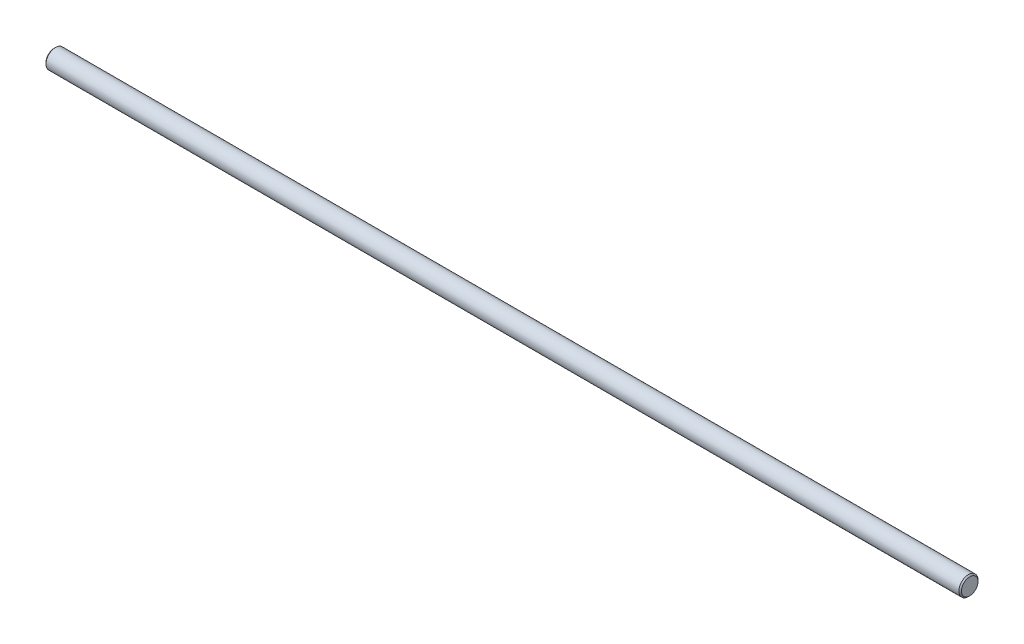
ISO-10303-21;
HEADER;
FILE_DESCRIPTION(('STEP AP214'),'2;1');
FILE_NAME('part.step','',(''),(''),'','','');
FILE_SCHEMA(('AUTOMOTIVE_DESIGN { 1 0 10303 214 1 1 1 1 }'));
ENDSEC;
DATA;
#1=APPLICATION_CONTEXT('core data for automotive mechanical design processes');
#2=APPLICATION_PROTOCOL_DEFINITION('international standard','automotive_design',2000,#1);
#3=PRODUCT_CONTEXT('',#1,'mechanical');
#4=PRODUCT('Part','Part','',(#3));
#5=PRODUCT_RELATED_PRODUCT_CATEGORY('part','',(#4));
#6=PRODUCT_DEFINITION_FORMATION('','',#4);
#7=PRODUCT_DEFINITION_CONTEXT('part definition',#1,'design');
#8=PRODUCT_DEFINITION('design','',#6,#7);
#9=PRODUCT_DEFINITION_SHAPE('','',#8);
#10=(LENGTH_UNIT() NAMED_UNIT(*) SI_UNIT(.MILLI.,.METRE.));
#11=(NAMED_UNIT(*) PLANE_ANGLE_UNIT() SI_UNIT($,.RADIAN.));
#12=(NAMED_UNIT(*) SI_UNIT($,.STERADIAN.) SOLID_ANGLE_UNIT());
#13=UNCERTAINTY_MEASURE_WITH_UNIT(LENGTH_MEASURE(1.E-05),#10,'distance_accuracy_value','');
#14=(GEOMETRIC_REPRESENTATION_CONTEXT(3) GLOBAL_UNCERTAINTY_ASSIGNED_CONTEXT((#13)) GLOBAL_UNIT_ASSIGNED_CONTEXT((#10,
#11,#12)) REPRESENTATION_CONTEXT('',''));
#15=CARTESIAN_POINT('',(0.,0.,0.));
#16=DIRECTION('',(0.,0.,1.));
#17=DIRECTION('',(1.,0.,0.));
#18=AXIS2_PLACEMENT_3D('',#15,#16,#17);
#19=CARTESIAN_POINT('',(-228.6,0.,0.));
#20=DIRECTION('',(1.,0.,0.));
#21=DIRECTION('',(0.,0.,-1.));
#22=AXIS2_PLACEMENT_3D('',#19,#20,#21);
#23=CYLINDRICAL_SURFACE('',#22,4.7625);
#24=CARTESIAN_POINT('',(227.965,0.,0.));
#25=DIRECTION('',(1.,0.,0.));
#26=DIRECTION('',(0.,0.,-1.));
#27=AXIS2_PLACEMENT_3D('',#24,#25,#26);
#28=CIRCLE('',#27,4.7625);
#29=CARTESIAN_POINT('',(227.965,0.,-4.7625));
#30=VERTEX_POINT('',#29);
#31=EDGE_CURVE('E38',#30,#30,#28,.F.);
#32=CARTESIAN_POINT('',(-227.965,0.,0.));
#33=DIRECTION('',(1.,0.,0.));
#34=DIRECTION('',(0.,0.,-1.));
#35=AXIS2_PLACEMENT_3D('',#32,#33,#34);
#36=CIRCLE('',#35,4.7625);
#37=CARTESIAN_POINT('',(-227.965,0.,-4.7625));
#38=VERTEX_POINT('',#37);
#39=EDGE_CURVE('E42',#38,#38,#36,.T.);
#40=CARTESIAN_POINT('',(227.965,0.,-4.7625));
#41=CARTESIAN_POINT('',(223.215729166667,0.,-4.7625));
#42=CARTESIAN_POINT('',(218.466458333333,0.,-4.7625));
#43=CARTESIAN_POINT('',(208.967916666667,0.,-4.7625));
#44=CARTESIAN_POINT('',(204.218645833333,0.,-4.7625));
#45=CARTESIAN_POINT('',(194.720104166667,0.,-4.7625));
#46=CARTESIAN_POINT('',(189.970833333333,0.,-4.7625));
#47=CARTESIAN_POINT('',(180.472291666667,0.,-4.7625));
#48=CARTESIAN_POINT('',(175.723020833333,0.,-4.7625));
#49=CARTESIAN_POINT('',(166.224479166667,0.,-4.7625));
#50=CARTESIAN_POINT('',(161.475208333333,0.,-4.7625));
#51=CARTESIAN_POINT('',(151.976666666667,0.,-4.7625));
#52=CARTESIAN_POINT('',(147.227395833333,0.,-4.7625));
#53=CARTESIAN_POINT('',(137.728854166667,0.,-4.7625));
#54=CARTESIAN_POINT('',(132.979583333333,0.,-4.7625));
#55=CARTESIAN_POINT('',(123.481041666667,0.,-4.7625));
#56=CARTESIAN_POINT('',(118.731770833333,0.,-4.7625));
#57=CARTESIAN_POINT('',(109.233229166667,0.,-4.7625));
#58=CARTESIAN_POINT('',(104.483958333333,0.,-4.7625));
#59=CARTESIAN_POINT('',(94.9854166666666,0.,-4.7625));
#60=CARTESIAN_POINT('',(90.2361458333333,0.,-4.7625));
#61=CARTESIAN_POINT('',(80.7376041666666,0.,-4.7625));
#62=CARTESIAN_POINT('',(75.9883333333333,0.,-4.7625));
#63=CARTESIAN_POINT('',(66.4897916666666,0.,-4.7625));
#64=CARTESIAN_POINT('',(61.7405208333333,0.,-4.7625));
#65=CARTESIAN_POINT('',(52.2419791666667,0.,-4.7625));
#66=CARTESIAN_POINT('',(47.4927083333333,0.,-4.7625));
#67=CARTESIAN_POINT('',(37.9941666666666,0.,-4.7625));
#68=CARTESIAN_POINT('',(33.2448958333333,0.,-4.7625));
#69=CARTESIAN_POINT('',(23.7463541666666,0.,-4.7625));
#70=CARTESIAN_POINT('',(18.9970833333333,0.,-4.7625));
#71=CARTESIAN_POINT('',(9.49854166666668,0.,-4.7625));
#72=CARTESIAN_POINT('',(4.74927083333336,0.,-4.7625));
#73=CARTESIAN_POINT('',(-4.7492708333333,0.,-4.7625));
#74=CARTESIAN_POINT('',(-9.49854166666663,0.,-4.7625));
#75=CARTESIAN_POINT('',(-18.9970833333333,0.,-4.7625));
#76=CARTESIAN_POINT('',(-23.7463541666666,0.,-4.7625));
#77=CARTESIAN_POINT('',(-33.2448958333333,0.,-4.7625));
#78=CARTESIAN_POINT('',(-37.9941666666666,0.,-4.7625));
#79=CARTESIAN_POINT('',(-47.4927083333333,0.,-4.7625));
#80=CARTESIAN_POINT('',(-52.2419791666666,0.,-4.7625));
#81=CARTESIAN_POINT('',(-61.7405208333333,0.,-4.7625));
#82=CARTESIAN_POINT('',(-66.4897916666666,0.,-4.7625));
#83=CARTESIAN_POINT('',(-75.9883333333333,0.,-4.7625));
#84=CARTESIAN_POINT('',(-80.7376041666666,0.,-4.7625));
#85=CARTESIAN_POINT('',(-90.2361458333333,0.,-4.7625));
#86=CARTESIAN_POINT('',(-94.9854166666666,0.,-4.7625));
#87=CARTESIAN_POINT('',(-104.483958333333,0.,-4.7625));
#88=CARTESIAN_POINT('',(-109.233229166667,0.,-4.7625));
#89=CARTESIAN_POINT('',(-118.731770833333,0.,-4.7625));
#90=CARTESIAN_POINT('',(-123.481041666667,0.,-4.7625));
#91=CARTESIAN_POINT('',(-132.979583333333,0.,-4.7625));
#92=CARTESIAN_POINT('',(-137.728854166667,0.,-4.7625));
#93=CARTESIAN_POINT('',(-147.227395833333,0.,-4.7625));
#94=CARTESIAN_POINT('',(-151.976666666667,0.,-4.7625));
#95=CARTESIAN_POINT('',(-161.475208333333,0.,-4.7625));
#96=CARTESIAN_POINT('',(-166.224479166667,0.,-4.7625));
#97=CARTESIAN_POINT('',(-175.723020833333,0.,-4.7625));
#98=CARTESIAN_POINT('',(-180.472291666667,0.,-4.7625));
#99=CARTESIAN_POINT('',(-189.970833333333,0.,-4.7625));
#100=CARTESIAN_POINT('',(-194.720104166667,0.,-4.7625));
#101=CARTESIAN_POINT('',(-204.218645833333,0.,-4.7625));
#102=CARTESIAN_POINT('',(-208.967916666667,0.,-4.7625));
#103=CARTESIAN_POINT('',(-218.466458333333,0.,-4.7625));
#104=CARTESIAN_POINT('',(-223.215729166667,0.,-4.7625));
#105=CARTESIAN_POINT('',(-227.965,0.,-4.7625));
#106=B_SPLINE_CURVE_WITH_KNOTS('',3,(#40,#41,#42,#43,#44,#45,#46,#47,#48,#49,#50,#51,#52,#53,
#54,#55,#56,#57,#58,#59,#60,#61,#62,#63,#64,#65,#66,#67,#68,#69,#70,#71,#72,#73,#74,#75,#76,#77,
#78,#79,#80,#81,#82,#83,#84,#85,#86,#87,#88,#89,#90,#91,#92,#93,#94,#95,#96,#97,#98,#99,#100,
#101,#102,#103,#104,#105),.UNSPECIFIED.,.F.,.F.,(4,2,2,2,2,2,2,2,2,2,2,2,2,2,2,2,2,2,2,2,2,2,2,
2,2,2,2,2,2,2,2,2,4),(0.,14.2478125,28.495625,42.7434375,56.99125,71.2390625,85.486875,
99.7346875,113.9825,128.2303125,142.478125,156.7259375,170.97375,185.2215625,199.469375,
213.7171875,227.965,242.2128125,256.460625,270.7084375,284.95625,299.2040625,313.451875,
327.6996875,341.9475,356.1953125,370.443125,384.6909375,398.93875,413.1865625,427.434375,
441.6821875,455.93),.UNSPECIFIED.);
#107=EDGE_CURVE('BSEAM31',#30,#38,#106,.T.);
#108=ORIENTED_EDGE('',*,*,#31,.T.);
#109=ORIENTED_EDGE('',*,*,#39,.T.);
#110=ORIENTED_EDGE('',*,*,#107,.T.);
#111=ORIENTED_EDGE('',*,*,#107,.F.);
#112=EDGE_LOOP('',(#108,#110,#109,#111));
#113=FACE_BOUND('',#112,.T.);
#114=ADVANCED_FACE('F31',(#113),#23,.T.);
#115=CARTESIAN_POINT('',(-228.6,0.,0.));
#116=DIRECTION('',(1.,0.,0.));
#117=DIRECTION('',(0.,0.,-1.));
#118=AXIS2_PLACEMENT_3D('',#115,#116,#117);
#119=PLANE('',#118);
#120=CARTESIAN_POINT('',(-228.6,0.,0.));
#121=DIRECTION('',(1.,0.,0.));
#122=DIRECTION('',(0.,0.,-1.));
#123=AXIS2_PLACEMENT_3D('',#120,#121,#122);
#124=CIRCLE('',#123,4.12749999999984);
#125=CARTESIAN_POINT('',(-228.6,0.,-4.12749999999984));
#126=VERTEX_POINT('',#125);
#127=EDGE_CURVE('E10',#126,#126,#124,.F.);
#128=ORIENTED_EDGE('',*,*,#127,.T.);
#129=EDGE_LOOP('',(#128));
#130=FACE_BOUND('',#129,.T.);
#131=ADVANCED_FACE('F62',(#130),#119,.F.);
#132=CARTESIAN_POINT('',(228.6,0.,0.));
#133=DIRECTION('',(1.,0.,0.));
#134=DIRECTION('',(0.,0.,-1.));
#135=AXIS2_PLACEMENT_3D('',#132,#133,#134);
#136=PLANE('',#135);
#137=CARTESIAN_POINT('',(228.6,0.,0.));
#138=DIRECTION('',(1.,0.,0.));
#139=DIRECTION('',(0.,0.,-1.));
#140=AXIS2_PLACEMENT_3D('',#137,#138,#139);
#141=CIRCLE('',#140,4.12750000000006);
#142=CARTESIAN_POINT('',(228.6,0.,-4.12750000000006));
#143=VERTEX_POINT('',#142);
#144=EDGE_CURVE('E46',#143,#143,#141,.T.);
#145=ORIENTED_EDGE('',*,*,#144,.T.);
#146=EDGE_LOOP('',(#145));
#147=FACE_BOUND('',#146,.T.);
#148=ADVANCED_FACE('F52',(#147),#136,.T.);
#149=CARTESIAN_POINT('',(228.6,0.,0.));
#150=DIRECTION('',(-1.,0.,0.));
#151=DIRECTION('',(0.,0.,1.));
#152=AXIS2_PLACEMENT_3D('',#149,#150,#151);
#153=CONICAL_SURFACE('',#152,4.12750000000006,0.785398163397447);
#154=ORIENTED_EDGE('',*,*,#31,.F.);
#155=EDGE_LOOP('',(#154));
#156=FACE_BOUND('',#155,.T.);
#157=ORIENTED_EDGE('',*,*,#144,.F.);
#158=EDGE_LOOP('',(#157));
#159=FACE_BOUND('',#158,.T.);
#160=ADVANCED_FACE('F54',(#156,#159),#153,.T.);
#161=CARTESIAN_POINT('',(-227.965,0.,0.));
#162=DIRECTION('',(1.,0.,0.));
#163=DIRECTION('',(0.,0.,-1.));
#164=AXIS2_PLACEMENT_3D('',#161,#162,#163);
#165=CONICAL_SURFACE('',#164,4.7625,0.785398163397447);
#166=ORIENTED_EDGE('',*,*,#127,.F.);
#167=EDGE_LOOP('',(#166));
#168=FACE_BOUND('',#167,.T.);
#169=ORIENTED_EDGE('',*,*,#39,.F.);
#170=EDGE_LOOP('',(#169));
#171=FACE_BOUND('',#170,.T.);
#172=ADVANCED_FACE('F33',(#168,#171),#165,.T.);
#173=CLOSED_SHELL('',(#114,#131,#148,#160,#172));
#174=MANIFOLD_SOLID_BREP('B2',#173);
#175=ADVANCED_BREP_SHAPE_REPRESENTATION('',(#18,#174),#14);
#176=SHAPE_DEFINITION_REPRESENTATION(#9,#175);
ENDSEC;
END-ISO-10303-21;
